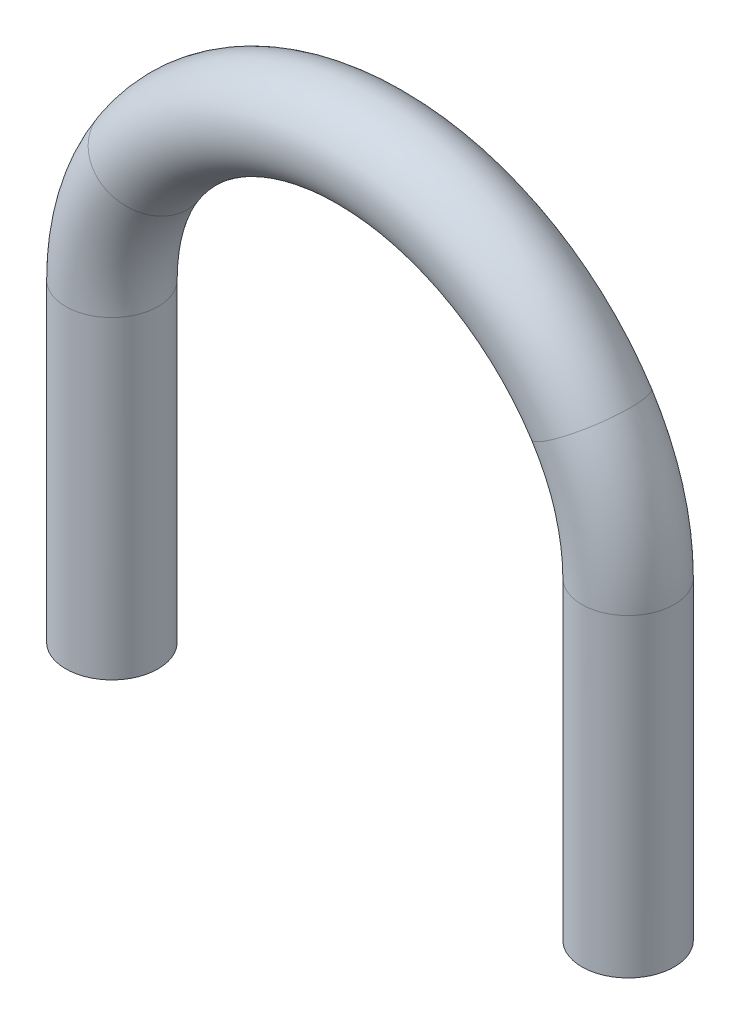
ISO-10303-21;
HEADER;
FILE_DESCRIPTION(('STEP AP214'),'2;1');
FILE_NAME('part.step','',(''),(''),'','','');
FILE_SCHEMA(('AUTOMOTIVE_DESIGN { 1 0 10303 214 1 1 1 1 }'));
ENDSEC;
DATA;
#1=APPLICATION_CONTEXT('core data for automotive mechanical design processes');
#2=APPLICATION_PROTOCOL_DEFINITION('international standard','automotive_design',2000,#1);
#3=PRODUCT_CONTEXT('',#1,'mechanical');
#4=PRODUCT('Part','Part','',(#3));
#5=PRODUCT_RELATED_PRODUCT_CATEGORY('part','',(#4));
#6=PRODUCT_DEFINITION_FORMATION('','',#4);
#7=PRODUCT_DEFINITION_CONTEXT('part definition',#1,'design');
#8=PRODUCT_DEFINITION('design','',#6,#7);
#9=PRODUCT_DEFINITION_SHAPE('','',#8);
#10=(LENGTH_UNIT() NAMED_UNIT(*) SI_UNIT(.MILLI.,.METRE.));
#11=(NAMED_UNIT(*) PLANE_ANGLE_UNIT() SI_UNIT($,.RADIAN.));
#12=(NAMED_UNIT(*) SI_UNIT($,.STERADIAN.) SOLID_ANGLE_UNIT());
#13=UNCERTAINTY_MEASURE_WITH_UNIT(LENGTH_MEASURE(1.E-05),#10,'distance_accuracy_value','');
#14=(GEOMETRIC_REPRESENTATION_CONTEXT(3) GLOBAL_UNCERTAINTY_ASSIGNED_CONTEXT((#13)) GLOBAL_UNIT_ASSIGNED_CONTEXT((#10,
#11,#12)) REPRESENTATION_CONTEXT('',''));
#15=CARTESIAN_POINT('',(0.,0.,0.));
#16=DIRECTION('',(0.,0.,1.));
#17=DIRECTION('',(1.,0.,0.));
#18=AXIS2_PLACEMENT_3D('',#15,#16,#17);
#19=CARTESIAN_POINT('',(97.830035602148,-53.9230288637611,0.));
#20=DIRECTION('',(0.,1.,0.));
#21=DIRECTION('',(-1.,0.,0.));
#22=AXIS2_PLACEMENT_3D('',#19,#20,#21);
#23=PLANE('',#22);
#24=CARTESIAN_POINT('',(97.830035602148,-53.9230288637611,0.));
#25=DIRECTION('',(0.,1.,0.));
#26=DIRECTION('',(-1.,0.,0.));
#27=AXIS2_PLACEMENT_3D('',#24,#25,#26);
#28=CIRCLE('',#27,12.5);
#29=CARTESIAN_POINT('',(85.330035602148,-53.9230288637611,0.));
#30=VERTEX_POINT('',#29);
#31=EDGE_CURVE('E70',#30,#30,#28,.T.);
#32=ORIENTED_EDGE('',*,*,#31,.F.);
#33=EDGE_LOOP('',(#32));
#34=FACE_BOUND('',#33,.T.);
#35=ADVANCED_FACE('F48',(#34),#23,.F.);
#36=CARTESIAN_POINT('',(-41.9271581152063,-53.9230288637611,0.));
#37=DIRECTION('',(0.,-1.,0.));
#38=DIRECTION('',(1.,0.,0.));
#39=AXIS2_PLACEMENT_3D('',#36,#37,#38);
#40=PLANE('',#39);
#41=CARTESIAN_POINT('',(-41.9271581152063,-53.9230288637611,0.));
#42=DIRECTION('',(0.,-1.,0.));
#43=DIRECTION('',(1.,0.,0.));
#44=AXIS2_PLACEMENT_3D('',#41,#42,#43);
#45=CIRCLE('',#44,12.5);
#46=CARTESIAN_POINT('',(-29.4271581152063,-53.9230288637611,0.));
#47=VERTEX_POINT('',#46);
#48=EDGE_CURVE('E11',#47,#47,#45,.T.);
#49=ORIENTED_EDGE('',*,*,#48,.T.);
#50=EDGE_LOOP('',(#49));
#51=FACE_BOUND('',#50,.T.);
#52=ADVANCED_FACE('F77',(#51),#40,.T.);
#53=CARTESIAN_POINT('',(97.830035602148,-53.9230288637611,0.));
#54=DIRECTION('',(0.,1.,0.));
#55=DIRECTION('',(-1.,0.,0.));
#56=AXIS2_PLACEMENT_3D('',#53,#54,#55);
#57=CYLINDRICAL_SURFACE('',#56,12.5);
#58=CARTESIAN_POINT('',(97.830035602148,31.0478029286032,0.));
#59=DIRECTION('',(0.,1.,0.));
#60=DIRECTION('',(-1.,0.,0.));
#61=AXIS2_PLACEMENT_3D('',#58,#59,#60);
#62=CIRCLE('',#61,12.5);
#63=CARTESIAN_POINT('',(110.330035602148,31.0478029286033,0.));
#64=VERTEX_POINT('',#63);
#65=EDGE_CURVE('E67',#64,#64,#62,.T.);
#66=ORIENTED_EDGE('',*,*,#65,.F.);
#67=EDGE_LOOP('',(#66));
#68=FACE_BOUND('',#67,.T.);
#69=ORIENTED_EDGE('',*,*,#31,.T.);
#70=EDGE_LOOP('',(#69));
#71=FACE_BOUND('',#70,.T.);
#72=ADVANCED_FACE('F74',(#68,#71),#57,.T.);
#73=CARTESIAN_POINT('',(36.3425924075694,31.047802928603,0.));
#74=DIRECTION('',(0.,0.,1.));
#75=DIRECTION('',(1.,0.,0.));
#76=AXIS2_PLACEMENT_3D('',#73,#74,#75);
#77=TOROIDAL_SURFACE('',#76,61.4874431945786,12.5);
#78=CARTESIAN_POINT('',(87.9522910375309,64.4715172334357,0.));
#79=DIRECTION('',(-0.543586016401147,0.839353467124031,0.));
#80=DIRECTION('',(-0.839353467124031,-0.543586016401147,0.));
#81=AXIS2_PLACEMENT_3D('',#78,#79,#80);
#82=CIRCLE('',#81,12.5);
#83=CARTESIAN_POINT('',(98.4442093765813,71.2663424384501,0.));
#84=VERTEX_POINT('',#83);
#85=EDGE_CURVE('E62',#84,#84,#82,.T.);
#86=CARTESIAN_POINT('',(36.3425924075694,31.047802928603,0.));
#87=DIRECTION('',(0.,0.,1.));
#88=DIRECTION('',(1.,0.,0.));
#89=AXIS2_PLACEMENT_3D('',#86,#87,#88);
#90=CIRCLE('',#89,73.9874431945786);
#91=EDGE_CURVE('',#64,#84,#90,.T.);
#92=ORIENTED_EDGE('',*,*,#65,.T.);
#93=ORIENTED_EDGE('',*,*,#85,.F.);
#94=ORIENTED_EDGE('',*,*,#91,.T.);
#95=ORIENTED_EDGE('',*,*,#91,.F.);
#96=EDGE_LOOP('',(#92,#94,#93,#95));
#97=FACE_BOUND('',#96,.T.);
#98=ADVANCED_FACE('F95',(#97),#77,.T.);
#99=CARTESIAN_POINT('',(27.9514387434709,25.613484763568,0.));
#100=DIRECTION('',(0.,0.,1.));
#101=DIRECTION('',(1.,0.,0.));
#102=AXIS2_PLACEMENT_3D('',#99,#100,#101);
#103=TOROIDAL_SURFACE('',#102,71.484606478898,12.5);
#104=CARTESIAN_POINT('',(-32.0494135505892,64.4715172334357,0.));
#105=DIRECTION('',(-0.543586016401146,-0.839353467124032,0.));
#106=DIRECTION('',(0.839353467124032,-0.543586016401146,0.));
#107=AXIS2_PLACEMENT_3D('',#104,#105,#106);
#108=CIRCLE('',#107,12.5);
#109=CARTESIAN_POINT('',(-42.5413318896396,71.26634243845,0.));
#110=VERTEX_POINT('',#109);
#111=EDGE_CURVE('E58',#110,#110,#108,.T.);
#112=CARTESIAN_POINT('',(27.9514387434709,25.613484763568,0.));
#113=DIRECTION('',(0.,0.,1.));
#114=DIRECTION('',(1.,0.,0.));
#115=AXIS2_PLACEMENT_3D('',#112,#113,#114);
#116=CIRCLE('',#115,83.984606478898);
#117=EDGE_CURVE('',#84,#110,#116,.T.);
#118=ORIENTED_EDGE('',*,*,#85,.T.);
#119=ORIENTED_EDGE('',*,*,#111,.F.);
#120=ORIENTED_EDGE('',*,*,#117,.T.);
#121=ORIENTED_EDGE('',*,*,#117,.F.);
#122=EDGE_LOOP('',(#118,#120,#119,#121));
#123=FACE_BOUND('',#122,.T.);
#124=ADVANCED_FACE('F89',(#123),#103,.T.);
#125=CARTESIAN_POINT('',(19.5602850793723,31.047802928603,0.));
#126=DIRECTION('',(0.,0.,1.));
#127=DIRECTION('',(1.,0.,0.));
#128=AXIS2_PLACEMENT_3D('',#125,#126,#127);
#129=TOROIDAL_SURFACE('',#128,61.4874431945786,12.5);
#130=CARTESIAN_POINT('',(-41.9271581152063,31.047802928603,0.));
#131=DIRECTION('',(0.,-1.,0.));
#132=DIRECTION('',(1.,0.,0.));
#133=AXIS2_PLACEMENT_3D('',#130,#131,#132);
#134=CIRCLE('',#133,12.5);
#135=CARTESIAN_POINT('',(-54.4271581152063,31.047802928603,0.));
#136=VERTEX_POINT('',#135);
#137=EDGE_CURVE('E54',#136,#136,#134,.T.);
#138=CARTESIAN_POINT('',(19.5602850793723,31.047802928603,0.));
#139=DIRECTION('',(0.,0.,1.));
#140=DIRECTION('',(1.,0.,0.));
#141=AXIS2_PLACEMENT_3D('',#138,#139,#140);
#142=CIRCLE('',#141,73.9874431945786);
#143=EDGE_CURVE('',#110,#136,#142,.T.);
#144=ORIENTED_EDGE('',*,*,#111,.T.);
#145=ORIENTED_EDGE('',*,*,#137,.F.);
#146=ORIENTED_EDGE('',*,*,#143,.T.);
#147=ORIENTED_EDGE('',*,*,#143,.F.);
#148=EDGE_LOOP('',(#144,#146,#145,#147));
#149=FACE_BOUND('',#148,.T.);
#150=ADVANCED_FACE('F83',(#149),#129,.T.);
#151=CARTESIAN_POINT('',(-41.9271581152063,31.047802928603,0.));
#152=DIRECTION('',(0.,-1.,0.));
#153=DIRECTION('',(1.,0.,0.));
#154=AXIS2_PLACEMENT_3D('',#151,#152,#153);
#155=CYLINDRICAL_SURFACE('',#154,12.5);
#156=ORIENTED_EDGE('',*,*,#48,.F.);
#157=EDGE_LOOP('',(#156));
#158=FACE_BOUND('',#157,.T.);
#159=ORIENTED_EDGE('',*,*,#137,.T.);
#160=EDGE_LOOP('',(#159));
#161=FACE_BOUND('',#160,.T.);
#162=ADVANCED_FACE('F81',(#158,#161),#155,.T.);
#163=CLOSED_SHELL('',(#35,#52,#72,#98,#124,#150,#162));
#164=MANIFOLD_SOLID_BREP('B2',#163);
#165=ADVANCED_BREP_SHAPE_REPRESENTATION('',(#18,#164),#14);
#166=SHAPE_DEFINITION_REPRESENTATION(#9,#165);
ENDSEC;
END-ISO-10303-21;
